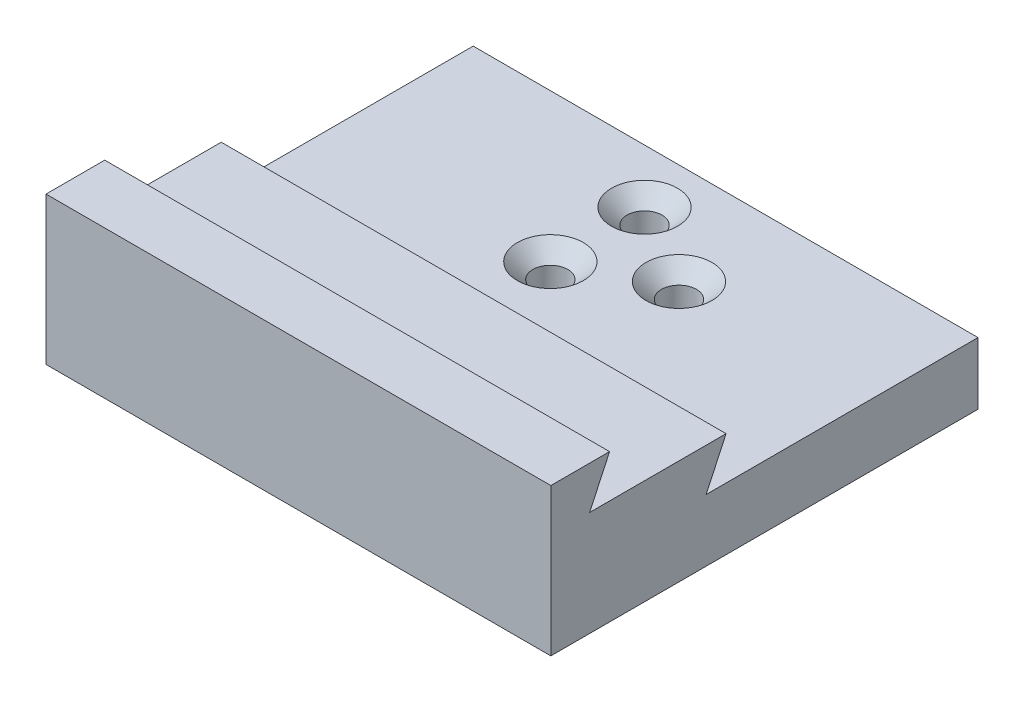
ISO-10303-21;
HEADER;
FILE_DESCRIPTION(('STEP AP214'),'2;1');
FILE_NAME('part.step','',(''),(''),'','','');
FILE_SCHEMA(('AUTOMOTIVE_DESIGN { 1 0 10303 214 1 1 1 1 }'));
ENDSEC;
DATA;
#1=APPLICATION_CONTEXT('core data for automotive mechanical design processes');
#2=APPLICATION_PROTOCOL_DEFINITION('international standard','automotive_design',2000,#1);
#3=PRODUCT_CONTEXT('',#1,'mechanical');
#4=PRODUCT('Part','Part','',(#3));
#5=PRODUCT_RELATED_PRODUCT_CATEGORY('part','',(#4));
#6=PRODUCT_DEFINITION_FORMATION('','',#4);
#7=PRODUCT_DEFINITION_CONTEXT('part definition',#1,'design');
#8=PRODUCT_DEFINITION('design','',#6,#7);
#9=PRODUCT_DEFINITION_SHAPE('','',#8);
#10=(LENGTH_UNIT() NAMED_UNIT(*) SI_UNIT(.MILLI.,.METRE.));
#11=(NAMED_UNIT(*) PLANE_ANGLE_UNIT() SI_UNIT($,.RADIAN.));
#12=(NAMED_UNIT(*) SI_UNIT($,.STERADIAN.) SOLID_ANGLE_UNIT());
#13=UNCERTAINTY_MEASURE_WITH_UNIT(LENGTH_MEASURE(1.E-05),#10,'distance_accuracy_value','');
#14=(GEOMETRIC_REPRESENTATION_CONTEXT(3) GLOBAL_UNCERTAINTY_ASSIGNED_CONTEXT((#13)) GLOBAL_UNIT_ASSIGNED_CONTEXT((#10,
#11,#12)) REPRESENTATION_CONTEXT('',''));
#15=CARTESIAN_POINT('',(0.,0.,0.));
#16=DIRECTION('',(0.,0.,1.));
#17=DIRECTION('',(1.,0.,0.));
#18=AXIS2_PLACEMENT_3D('',#15,#16,#17);
#19=CARTESIAN_POINT('',(65.,0.,-55.));
#20=DIRECTION('',(0.,1.,0.));
#21=DIRECTION('',(0.,0.,1.));
#22=AXIS2_PLACEMENT_3D('',#19,#20,#21);
#23=PLANE('',#22);
#24=CARTESIAN_POINT('',(39.5,0.,-42.));
#25=DIRECTION('',(0.,1.,0.));
#26=DIRECTION('',(0.,0.,1.));
#27=AXIS2_PLACEMENT_3D('',#24,#25,#26);
#28=CIRCLE('',#27,2.25);
#29=CARTESIAN_POINT('',(39.5,0.,-39.75));
#30=VERTEX_POINT('',#29);
#31=EDGE_CURVE('E267',#30,#30,#28,.F.);
#32=ORIENTED_EDGE('',*,*,#31,.F.);
#33=EDGE_LOOP('',(#32));
#34=FACE_BOUND('',#33,.T.);
#35=CARTESIAN_POINT('',(29.,0.,-35.9378221735089));
#36=DIRECTION('',(0.,1.,0.));
#37=DIRECTION('',(0.,0.,1.));
#38=AXIS2_PLACEMENT_3D('',#35,#36,#37);
#39=CIRCLE('',#38,2.25000000000001);
#40=CARTESIAN_POINT('',(29.,0.,-33.6878221735089));
#41=VERTEX_POINT('',#40);
#42=EDGE_CURVE('E269',#41,#41,#39,.F.);
#43=ORIENTED_EDGE('',*,*,#42,.F.);
#44=EDGE_LOOP('',(#43));
#45=FACE_BOUND('',#44,.T.);
#46=CARTESIAN_POINT('',(29.0000000000001,0.,-48.0621778264911));
#47=DIRECTION('',(0.,1.,0.));
#48=DIRECTION('',(0.,0.,1.));
#49=AXIS2_PLACEMENT_3D('',#46,#47,#48);
#50=CIRCLE('',#49,2.25);
#51=CARTESIAN_POINT('',(29.0000000000001,0.,-45.8121778264911));
#52=VERTEX_POINT('',#51);
#53=EDGE_CURVE('E275',#52,#52,#50,.F.);
#54=ORIENTED_EDGE('',*,*,#53,.F.);
#55=EDGE_LOOP('',(#54));
#56=FACE_BOUND('',#55,.T.);
#57=DIRECTION('',(0.,0.,-1.));
#58=VECTOR('',#57,1.);
#59=CARTESIAN_POINT('',(0.,0.,-55.));
#60=LINE('',#59,#58);
#61=CARTESIAN_POINT('',(0.,0.,0.));
#62=VERTEX_POINT('',#61);
#63=CARTESIAN_POINT('',(0.,0.,-55.));
#64=VERTEX_POINT('',#63);
#65=EDGE_CURVE('E133',#62,#64,#60,.T.);
#66=ORIENTED_EDGE('',*,*,#65,.T.);
#67=DIRECTION('',(-1.,0.,0.));
#68=VECTOR('',#67,1.);
#69=CARTESIAN_POINT('',(65.,0.,-55.));
#70=LINE('',#69,#68);
#71=CARTESIAN_POINT('',(65.,0.,-55.));
#72=VERTEX_POINT('',#71);
#73=EDGE_CURVE('E161',#72,#64,#70,.T.);
#74=ORIENTED_EDGE('',*,*,#73,.F.);
#75=DIRECTION('',(0.,0.,-1.));
#76=VECTOR('',#75,1.);
#77=CARTESIAN_POINT('',(65.,0.,-55.));
#78=LINE('',#77,#76);
#79=CARTESIAN_POINT('',(65.,0.,0.));
#80=VERTEX_POINT('',#79);
#81=EDGE_CURVE('E148',#80,#72,#78,.T.);
#82=ORIENTED_EDGE('',*,*,#81,.F.);
#83=DIRECTION('',(-1.,0.,0.));
#84=VECTOR('',#83,1.);
#85=CARTESIAN_POINT('',(65.,0.,0.));
#86=LINE('',#85,#84);
#87=EDGE_CURVE('E129',#80,#62,#86,.T.);
#88=ORIENTED_EDGE('',*,*,#87,.T.);
#89=EDGE_LOOP('',(#66,#74,#82,#88));
#90=FACE_BOUND('',#89,.T.);
#91=ADVANCED_FACE('F34',(#34,#45,#56,#90),#23,.F.);
#92=CARTESIAN_POINT('',(65.,8.00000000000001,-55.));
#93=DIRECTION('',(0.,0.,1.));
#94=DIRECTION('',(1.,0.,0.));
#95=AXIS2_PLACEMENT_3D('',#92,#93,#94);
#96=PLANE('',#95);
#97=CARTESIAN_POINT('',(12.5,4.50000000000001,-55.));
#98=DIRECTION('',(0.,0.,-1.));
#99=DIRECTION('',(-1.,0.,0.));
#100=AXIS2_PLACEMENT_3D('',#97,#98,#99);
#101=CIRCLE('',#100,2.);
#102=CARTESIAN_POINT('',(10.5,4.50000000000001,-55.));
#103=VERTEX_POINT('',#102);
#104=EDGE_CURVE('E282',#103,#103,#101,.T.);
#105=ORIENTED_EDGE('',*,*,#104,.F.);
#106=EDGE_LOOP('',(#105));
#107=FACE_BOUND('',#106,.T.);
#108=CARTESIAN_POINT('',(52.5,4.50000000000001,-55.));
#109=DIRECTION('',(0.,0.,-1.));
#110=DIRECTION('',(1.,0.,0.));
#111=AXIS2_PLACEMENT_3D('',#108,#109,#110);
#112=CIRCLE('',#111,2.);
#113=CARTESIAN_POINT('',(54.5,4.50000000000001,-55.));
#114=VERTEX_POINT('',#113);
#115=EDGE_CURVE('E268',#114,#114,#112,.T.);
#116=ORIENTED_EDGE('',*,*,#115,.F.);
#117=EDGE_LOOP('',(#116));
#118=FACE_BOUND('',#117,.T.);
#119=DIRECTION('',(0.,1.,0.));
#120=VECTOR('',#119,1.);
#121=CARTESIAN_POINT('',(0.,8.00000000000001,-55.));
#122=LINE('',#121,#120);
#123=CARTESIAN_POINT('',(0.,8.00000000000001,-55.));
#124=VERTEX_POINT('',#123);
#125=EDGE_CURVE('E136',#64,#124,#122,.T.);
#126=ORIENTED_EDGE('',*,*,#125,.T.);
#127=DIRECTION('',(-1.,0.,0.));
#128=VECTOR('',#127,1.);
#129=CARTESIAN_POINT('',(65.,8.00000000000001,-55.));
#130=LINE('',#129,#128);
#131=CARTESIAN_POINT('',(65.,8.00000000000001,-55.));
#132=VERTEX_POINT('',#131);
#133=EDGE_CURVE('E158',#132,#124,#130,.T.);
#134=ORIENTED_EDGE('',*,*,#133,.F.);
#135=DIRECTION('',(0.,1.,0.));
#136=VECTOR('',#135,1.);
#137=CARTESIAN_POINT('',(65.,8.00000000000001,-55.));
#138=LINE('',#137,#136);
#139=EDGE_CURVE('E96',#72,#132,#138,.T.);
#140=ORIENTED_EDGE('',*,*,#139,.F.);
#141=ORIENTED_EDGE('',*,*,#73,.T.);
#142=EDGE_LOOP('',(#126,#134,#140,#141));
#143=FACE_BOUND('',#142,.T.);
#144=ADVANCED_FACE('F195',(#107,#118,#143),#96,.F.);
#145=CARTESIAN_POINT('',(65.,8.00000000000001,-20.));
#146=DIRECTION('',(0.,-1.,0.));
#147=DIRECTION('',(0.,0.,-1.));
#148=AXIS2_PLACEMENT_3D('',#145,#146,#147);
#149=PLANE('',#148);
#150=CARTESIAN_POINT('',(29.,8.00000000000001,-35.9378221735089));
#151=DIRECTION('',(0.,-1.,0.));
#152=DIRECTION('',(0.,0.,-1.));
#153=AXIS2_PLACEMENT_3D('',#150,#151,#152);
#154=CIRCLE('',#153,4.25000000000002);
#155=CARTESIAN_POINT('',(29.,8.00000000000001,-40.187822173509));
#156=VERTEX_POINT('',#155);
#157=EDGE_CURVE('E172',#156,#156,#154,.T.);
#158=ORIENTED_EDGE('',*,*,#157,.T.);
#159=EDGE_LOOP('',(#158));
#160=FACE_BOUND('',#159,.T.);
#161=CARTESIAN_POINT('',(29.0000000000001,8.00000000000001,-48.0621778264911));
#162=DIRECTION('',(0.,-1.,0.));
#163=DIRECTION('',(0.,0.,-1.));
#164=AXIS2_PLACEMENT_3D('',#161,#162,#163);
#165=CIRCLE('',#164,4.25000000000001);
#166=CARTESIAN_POINT('',(29.0000000000001,8.00000000000001,-52.3121778264911));
#167=VERTEX_POINT('',#166);
#168=EDGE_CURVE('E169',#167,#167,#165,.T.);
#169=ORIENTED_EDGE('',*,*,#168,.T.);
#170=EDGE_LOOP('',(#169));
#171=FACE_BOUND('',#170,.T.);
#172=CARTESIAN_POINT('',(39.5,8.00000000000001,-42.));
#173=DIRECTION('',(0.,-1.,0.));
#174=DIRECTION('',(0.,0.,-1.));
#175=AXIS2_PLACEMENT_3D('',#172,#173,#174);
#176=CIRCLE('',#175,4.25000000000002);
#177=CARTESIAN_POINT('',(39.5,8.00000000000001,-46.25));
#178=VERTEX_POINT('',#177);
#179=EDGE_CURVE('E166',#178,#178,#176,.T.);
#180=ORIENTED_EDGE('',*,*,#179,.T.);
#181=EDGE_LOOP('',(#180));
#182=FACE_BOUND('',#181,.T.);
#183=DIRECTION('',(0.,0.,1.));
#184=VECTOR('',#183,1.);
#185=CARTESIAN_POINT('',(0.,8.00000000000001,-20.));
#186=LINE('',#185,#184);
#187=CARTESIAN_POINT('',(0.,8.00000000000001,-20.));
#188=VERTEX_POINT('',#187);
#189=EDGE_CURVE('E139',#124,#188,#186,.T.);
#190=ORIENTED_EDGE('',*,*,#189,.T.);
#191=DIRECTION('',(-1.,0.,0.));
#192=VECTOR('',#191,1.);
#193=CARTESIAN_POINT('',(65.,8.00000000000001,-20.));
#194=LINE('',#193,#192);
#195=CARTESIAN_POINT('',(65.,8.00000000000001,-20.));
#196=VERTEX_POINT('',#195);
#197=EDGE_CURVE('E155',#196,#188,#194,.T.);
#198=ORIENTED_EDGE('',*,*,#197,.F.);
#199=DIRECTION('',(0.,0.,1.));
#200=VECTOR('',#199,1.);
#201=CARTESIAN_POINT('',(65.,8.00000000000001,-20.));
#202=LINE('',#201,#200);
#203=EDGE_CURVE('E289',#132,#196,#202,.T.);
#204=ORIENTED_EDGE('',*,*,#203,.F.);
#205=ORIENTED_EDGE('',*,*,#133,.T.);
#206=EDGE_LOOP('',(#190,#198,#204,#205));
#207=FACE_BOUND('',#206,.T.);
#208=ADVANCED_FACE('F201',(#160,#171,#182,#207),#149,.F.);
#209=CARTESIAN_POINT('',(65.,13.5,-22.5646921198525));
#210=DIRECTION('',(0.,0.422618261740704,0.906307787036648));
#211=DIRECTION('',(0.,-0.906307787036648,0.422618261740704));
#212=AXIS2_PLACEMENT_3D('',#209,#210,#211);
#213=PLANE('',#212);
#214=DIRECTION('',(0.,0.906307787036648,-0.422618261740704));
#215=VECTOR('',#214,1.);
#216=CARTESIAN_POINT('',(0.,13.5,-22.5646921198525));
#217=LINE('',#216,#215);
#218=CARTESIAN_POINT('',(0.,13.5,-22.5646921198525));
#219=VERTEX_POINT('',#218);
#220=EDGE_CURVE('E141',#188,#219,#217,.T.);
#221=ORIENTED_EDGE('',*,*,#220,.T.);
#222=DIRECTION('',(-1.,0.,0.));
#223=VECTOR('',#222,1.);
#224=CARTESIAN_POINT('',(65.,13.5,-22.5646921198525));
#225=LINE('',#224,#223);
#226=CARTESIAN_POINT('',(65.,13.5,-22.5646921198525));
#227=VERTEX_POINT('',#226);
#228=EDGE_CURVE('E152',#227,#219,#225,.T.);
#229=ORIENTED_EDGE('',*,*,#228,.F.);
#230=DIRECTION('',(0.,0.906307787036648,-0.422618261740704));
#231=VECTOR('',#230,1.);
#232=CARTESIAN_POINT('',(65.,13.5,-22.5646921198525));
#233=LINE('',#232,#231);
#234=EDGE_CURVE('E291',#196,#227,#233,.T.);
#235=ORIENTED_EDGE('',*,*,#234,.F.);
#236=ORIENTED_EDGE('',*,*,#197,.T.);
#237=EDGE_LOOP('',(#221,#229,#235,#236));
#238=FACE_BOUND('',#237,.T.);
#239=ADVANCED_FACE('F216',(#238),#213,.F.);
#240=CARTESIAN_POINT('',(65.,13.5,-5.));
#241=DIRECTION('',(0.,-1.,0.));
#242=DIRECTION('',(0.,0.,-1.));
#243=AXIS2_PLACEMENT_3D('',#240,#241,#242);
#244=PLANE('',#243);
#245=DIRECTION('',(0.,0.,1.));
#246=VECTOR('',#245,1.);
#247=CARTESIAN_POINT('',(0.,13.5,-5.));
#248=LINE('',#247,#246);
#249=CARTESIAN_POINT('',(0.,13.5,-5.));
#250=VERTEX_POINT('',#249);
#251=EDGE_CURVE('E143',#219,#250,#248,.T.);
#252=ORIENTED_EDGE('',*,*,#251,.T.);
#253=DIRECTION('',(-1.,0.,0.));
#254=VECTOR('',#253,1.);
#255=CARTESIAN_POINT('',(65.,13.5,-5.));
#256=LINE('',#255,#254);
#257=CARTESIAN_POINT('',(65.,13.5,-5.));
#258=VERTEX_POINT('',#257);
#259=EDGE_CURVE('E124',#258,#250,#256,.T.);
#260=ORIENTED_EDGE('',*,*,#259,.F.);
#261=DIRECTION('',(0.,0.,1.));
#262=VECTOR('',#261,1.);
#263=CARTESIAN_POINT('',(65.,13.5,-5.));
#264=LINE('',#263,#262);
#265=EDGE_CURVE('E115',#227,#258,#264,.T.);
#266=ORIENTED_EDGE('',*,*,#265,.F.);
#267=ORIENTED_EDGE('',*,*,#228,.T.);
#268=EDGE_LOOP('',(#252,#260,#266,#267));
#269=FACE_BOUND('',#268,.T.);
#270=ADVANCED_FACE('F220',(#269),#244,.F.);
#271=CARTESIAN_POINT('',(65.,19.,-7.56469211985252));
#272=DIRECTION('',(0.,0.422618261740704,0.906307787036648));
#273=DIRECTION('',(0.,-0.906307787036648,0.422618261740704));
#274=AXIS2_PLACEMENT_3D('',#271,#272,#273);
#275=PLANE('',#274);
#276=DIRECTION('',(0.,0.906307787036648,-0.422618261740704));
#277=VECTOR('',#276,1.);
#278=CARTESIAN_POINT('',(0.,19.,-7.56469211985252));
#279=LINE('',#278,#277);
#280=CARTESIAN_POINT('',(0.,19.,-7.56469211985252));
#281=VERTEX_POINT('',#280);
#282=EDGE_CURVE('E123',#250,#281,#279,.T.);
#283=ORIENTED_EDGE('',*,*,#282,.T.);
#284=DIRECTION('',(-1.,0.,0.));
#285=VECTOR('',#284,1.);
#286=CARTESIAN_POINT('',(65.,19.,-7.56469211985252));
#287=LINE('',#286,#285);
#288=CARTESIAN_POINT('',(65.,19.,-7.56469211985252));
#289=VERTEX_POINT('',#288);
#290=EDGE_CURVE('E120',#289,#281,#287,.T.);
#291=ORIENTED_EDGE('',*,*,#290,.F.);
#292=DIRECTION('',(0.,0.906307787036648,-0.422618261740704));
#293=VECTOR('',#292,1.);
#294=CARTESIAN_POINT('',(65.,19.,-7.56469211985252));
#295=LINE('',#294,#293);
#296=EDGE_CURVE('E109',#258,#289,#295,.T.);
#297=ORIENTED_EDGE('',*,*,#296,.F.);
#298=ORIENTED_EDGE('',*,*,#259,.T.);
#299=EDGE_LOOP('',(#283,#291,#297,#298));
#300=FACE_BOUND('',#299,.T.);
#301=ADVANCED_FACE('F121',(#300),#275,.F.);
#302=CARTESIAN_POINT('',(65.,19.,0.));
#303=DIRECTION('',(0.,-1.,0.));
#304=DIRECTION('',(0.,0.,-1.));
#305=AXIS2_PLACEMENT_3D('',#302,#303,#304);
#306=PLANE('',#305);
#307=DIRECTION('',(0.,0.,1.));
#308=VECTOR('',#307,1.);
#309=CARTESIAN_POINT('',(0.,19.,0.));
#310=LINE('',#309,#308);
#311=CARTESIAN_POINT('',(0.,19.,0.));
#312=VERTEX_POINT('',#311);
#313=EDGE_CURVE('E81',#281,#312,#310,.T.);
#314=ORIENTED_EDGE('',*,*,#313,.T.);
#315=DIRECTION('',(-1.,0.,0.));
#316=VECTOR('',#315,1.);
#317=CARTESIAN_POINT('',(65.,19.,0.));
#318=LINE('',#317,#316);
#319=CARTESIAN_POINT('',(65.,19.,0.));
#320=VERTEX_POINT('',#319);
#321=EDGE_CURVE('E125',#320,#312,#318,.T.);
#322=ORIENTED_EDGE('',*,*,#321,.F.);
#323=DIRECTION('',(0.,0.,1.));
#324=VECTOR('',#323,1.);
#325=CARTESIAN_POINT('',(65.,19.,0.));
#326=LINE('',#325,#324);
#327=EDGE_CURVE('E113',#289,#320,#326,.T.);
#328=ORIENTED_EDGE('',*,*,#327,.F.);
#329=ORIENTED_EDGE('',*,*,#290,.T.);
#330=EDGE_LOOP('',(#314,#322,#328,#329));
#331=FACE_BOUND('',#330,.T.);
#332=ADVANCED_FACE('F127',(#331),#306,.F.);
#333=CARTESIAN_POINT('',(65.,0.,0.));
#334=DIRECTION('',(0.,0.,-1.));
#335=DIRECTION('',(-1.,0.,0.));
#336=AXIS2_PLACEMENT_3D('',#333,#334,#335);
#337=PLANE('',#336);
#338=DIRECTION('',(0.,-1.,0.));
#339=VECTOR('',#338,1.);
#340=CARTESIAN_POINT('',(0.,0.,0.));
#341=LINE('',#340,#339);
#342=EDGE_CURVE('E87',#312,#62,#341,.T.);
#343=ORIENTED_EDGE('',*,*,#342,.T.);
#344=ORIENTED_EDGE('',*,*,#87,.F.);
#345=DIRECTION('',(0.,-1.,0.));
#346=VECTOR('',#345,1.);
#347=CARTESIAN_POINT('',(65.,0.,0.));
#348=LINE('',#347,#346);
#349=EDGE_CURVE('E52',#320,#80,#348,.T.);
#350=ORIENTED_EDGE('',*,*,#349,.F.);
#351=ORIENTED_EDGE('',*,*,#321,.T.);
#352=EDGE_LOOP('',(#343,#344,#350,#351));
#353=FACE_BOUND('',#352,.T.);
#354=ADVANCED_FACE('F229',(#353),#337,.F.);
#355=CARTESIAN_POINT('',(65.,0.,0.));
#356=DIRECTION('',(-1.,0.,0.));
#357=DIRECTION('',(0.,0.,1.));
#358=AXIS2_PLACEMENT_3D('',#355,#356,#357);
#359=PLANE('',#358);
#360=ORIENTED_EDGE('',*,*,#81,.T.);
#361=ORIENTED_EDGE('',*,*,#139,.T.);
#362=ORIENTED_EDGE('',*,*,#203,.T.);
#363=ORIENTED_EDGE('',*,*,#234,.T.);
#364=ORIENTED_EDGE('',*,*,#265,.T.);
#365=ORIENTED_EDGE('',*,*,#296,.T.);
#366=ORIENTED_EDGE('',*,*,#327,.T.);
#367=ORIENTED_EDGE('',*,*,#349,.T.);
#368=EDGE_LOOP('',(#360,#361,#362,#363,#364,#365,#366,#367));
#369=FACE_BOUND('',#368,.T.);
#370=ADVANCED_FACE('F111',(#369),#359,.F.);
#371=CARTESIAN_POINT('',(0.,0.,0.));
#372=DIRECTION('',(-1.,0.,0.));
#373=DIRECTION('',(0.,0.,1.));
#374=AXIS2_PLACEMENT_3D('',#371,#372,#373);
#375=PLANE('',#374);
#376=ORIENTED_EDGE('',*,*,#65,.F.);
#377=ORIENTED_EDGE('',*,*,#342,.F.);
#378=ORIENTED_EDGE('',*,*,#313,.F.);
#379=ORIENTED_EDGE('',*,*,#282,.F.);
#380=ORIENTED_EDGE('',*,*,#251,.F.);
#381=ORIENTED_EDGE('',*,*,#220,.F.);
#382=ORIENTED_EDGE('',*,*,#189,.F.);
#383=ORIENTED_EDGE('',*,*,#125,.F.);
#384=EDGE_LOOP('',(#376,#377,#378,#379,#380,#381,#382,#383));
#385=FACE_BOUND('',#384,.T.);
#386=ADVANCED_FACE('F232',(#385),#375,.T.);
#387=CARTESIAN_POINT('',(52.5,4.50000000000001,-35.));
#388=DIRECTION('',(0.,0.,-1.));
#389=DIRECTION('',(-1.,0.,0.));
#390=AXIS2_PLACEMENT_3D('',#387,#388,#389);
#391=CYLINDRICAL_SURFACE('',#390,2.);
#392=CARTESIAN_POINT('',(52.5,4.50000000000001,-35.));
#393=DIRECTION('',(0.,0.,-1.));
#394=DIRECTION('',(1.,0.,0.));
#395=AXIS2_PLACEMENT_3D('',#392,#393,#394);
#396=CIRCLE('',#395,2.);
#397=CARTESIAN_POINT('',(54.5,4.50000000000001,-35.));
#398=VERTEX_POINT('',#397);
#399=EDGE_CURVE('E272',#398,#398,#396,.T.);
#400=ORIENTED_EDGE('',*,*,#399,.F.);
#401=EDGE_LOOP('',(#400));
#402=FACE_BOUND('',#401,.T.);
#403=ORIENTED_EDGE('',*,*,#115,.T.);
#404=EDGE_LOOP('',(#403));
#405=FACE_BOUND('',#404,.T.);
#406=ADVANCED_FACE('F235',(#402,#405),#391,.F.);
#407=CARTESIAN_POINT('',(52.5,4.50000000000001,-35.));
#408=DIRECTION('',(0.,0.,1.));
#409=DIRECTION('',(1.,0.,0.));
#410=AXIS2_PLACEMENT_3D('',#407,#408,#409);
#411=PLANE('',#410);
#412=ORIENTED_EDGE('',*,*,#399,.T.);
#413=EDGE_LOOP('',(#412));
#414=FACE_BOUND('',#413,.T.);
#415=ADVANCED_FACE('F241',(#414),#411,.F.);
#416=CARTESIAN_POINT('',(12.5,4.50000000000001,-35.));
#417=DIRECTION('',(0.,0.,-1.));
#418=DIRECTION('',(-1.,0.,0.));
#419=AXIS2_PLACEMENT_3D('',#416,#417,#418);
#420=CYLINDRICAL_SURFACE('',#419,2.);
#421=CARTESIAN_POINT('',(12.5,4.50000000000001,-35.));
#422=DIRECTION('',(0.,0.,-1.));
#423=DIRECTION('',(-1.,0.,0.));
#424=AXIS2_PLACEMENT_3D('',#421,#422,#423);
#425=CIRCLE('',#424,2.);
#426=CARTESIAN_POINT('',(10.5,4.50000000000001,-35.));
#427=VERTEX_POINT('',#426);
#428=EDGE_CURVE('E137',#427,#427,#425,.T.);
#429=ORIENTED_EDGE('',*,*,#428,.F.);
#430=EDGE_LOOP('',(#429));
#431=FACE_BOUND('',#430,.T.);
#432=ORIENTED_EDGE('',*,*,#104,.T.);
#433=EDGE_LOOP('',(#432));
#434=FACE_BOUND('',#433,.T.);
#435=ADVANCED_FACE('F245',(#431,#434),#420,.F.);
#436=CARTESIAN_POINT('',(12.5,4.50000000000001,-35.));
#437=DIRECTION('',(0.,0.,-1.));
#438=DIRECTION('',(-1.,0.,0.));
#439=AXIS2_PLACEMENT_3D('',#436,#437,#438);
#440=PLANE('',#439);
#441=ORIENTED_EDGE('',*,*,#428,.T.);
#442=EDGE_LOOP('',(#441));
#443=FACE_BOUND('',#442,.T.);
#444=ADVANCED_FACE('F249',(#443),#440,.T.);
#445=CARTESIAN_POINT('',(29.0000000000001,-6.36396103067895,-48.0621778264911));
#446=DIRECTION('',(0.,1.,0.));
#447=DIRECTION('',(0.,0.,1.));
#448=AXIS2_PLACEMENT_3D('',#445,#446,#447);
#449=CYLINDRICAL_SURFACE('',#448,2.25);
#450=CARTESIAN_POINT('',(29.0000000000001,6.00000000000001,-48.0621778264911));
#451=DIRECTION('',(0.,-1.,0.));
#452=DIRECTION('',(0.,0.,-1.));
#453=AXIS2_PLACEMENT_3D('',#450,#451,#452);
#454=CIRCLE('',#453,2.25);
#455=CARTESIAN_POINT('',(29.0000000000001,6.00000000000001,-50.3121778264911));
#456=VERTEX_POINT('',#455);
#457=EDGE_CURVE('E44',#456,#456,#454,.F.);
#458=ORIENTED_EDGE('',*,*,#457,.T.);
#459=EDGE_LOOP('',(#458));
#460=FACE_BOUND('',#459,.T.);
#461=ORIENTED_EDGE('',*,*,#53,.T.);
#462=EDGE_LOOP('',(#461));
#463=FACE_BOUND('',#462,.T.);
#464=ADVANCED_FACE('F177',(#460,#463),#449,.F.);
#465=CARTESIAN_POINT('',(29.,-6.36396103067895,-35.9378221735089));
#466=DIRECTION('',(0.,1.,0.));
#467=DIRECTION('',(0.,0.,1.));
#468=AXIS2_PLACEMENT_3D('',#465,#466,#467);
#469=CYLINDRICAL_SURFACE('',#468,2.25000000000001);
#470=CARTESIAN_POINT('',(29.,6.,-35.9378221735089));
#471=DIRECTION('',(0.,-1.,0.));
#472=DIRECTION('',(0.,0.,-1.));
#473=AXIS2_PLACEMENT_3D('',#470,#471,#472);
#474=CIRCLE('',#473,2.25000000000001);
#475=CARTESIAN_POINT('',(29.,6.,-38.187822173509));
#476=VERTEX_POINT('',#475);
#477=EDGE_CURVE('E163',#476,#476,#474,.F.);
#478=ORIENTED_EDGE('',*,*,#477,.T.);
#479=EDGE_LOOP('',(#478));
#480=FACE_BOUND('',#479,.T.);
#481=ORIENTED_EDGE('',*,*,#42,.T.);
#482=EDGE_LOOP('',(#481));
#483=FACE_BOUND('',#482,.T.);
#484=ADVANCED_FACE('F256',(#480,#483),#469,.F.);
#485=CARTESIAN_POINT('',(39.5,-6.36396103067895,-42.));
#486=DIRECTION('',(0.,1.,0.));
#487=DIRECTION('',(0.,0.,1.));
#488=AXIS2_PLACEMENT_3D('',#485,#486,#487);
#489=CYLINDRICAL_SURFACE('',#488,2.25);
#490=CARTESIAN_POINT('',(39.5,6.00000000000001,-42.));
#491=DIRECTION('',(0.,-1.,0.));
#492=DIRECTION('',(0.,0.,-1.));
#493=AXIS2_PLACEMENT_3D('',#490,#491,#492);
#494=CIRCLE('',#493,2.25);
#495=CARTESIAN_POINT('',(39.5,6.00000000000001,-44.25));
#496=VERTEX_POINT('',#495);
#497=EDGE_CURVE('E11',#496,#496,#494,.F.);
#498=ORIENTED_EDGE('',*,*,#497,.T.);
#499=EDGE_LOOP('',(#498));
#500=FACE_BOUND('',#499,.T.);
#501=ORIENTED_EDGE('',*,*,#31,.T.);
#502=EDGE_LOOP('',(#501));
#503=FACE_BOUND('',#502,.T.);
#504=ADVANCED_FACE('F189',(#500,#503),#489,.F.);
#505=CARTESIAN_POINT('',(29.,6.,-35.9378221735089));
#506=DIRECTION('',(0.,1.,0.));
#507=DIRECTION('',(0.,0.,1.));
#508=AXIS2_PLACEMENT_3D('',#505,#506,#507);
#509=CONICAL_SURFACE('',#508,2.25000000000001,0.785398163397449);
#510=ORIENTED_EDGE('',*,*,#157,.F.);
#511=EDGE_LOOP('',(#510));
#512=FACE_BOUND('',#511,.T.);
#513=ORIENTED_EDGE('',*,*,#477,.F.);
#514=EDGE_LOOP('',(#513));
#515=FACE_BOUND('',#514,.T.);
#516=ADVANCED_FACE('F182',(#512,#515),#509,.F.);
#517=CARTESIAN_POINT('',(29.0000000000001,6.00000000000001,-48.0621778264911));
#518=DIRECTION('',(0.,1.,0.));
#519=DIRECTION('',(0.,0.,1.));
#520=AXIS2_PLACEMENT_3D('',#517,#518,#519);
#521=CONICAL_SURFACE('',#520,2.25,0.785398163397451);
#522=ORIENTED_EDGE('',*,*,#168,.F.);
#523=EDGE_LOOP('',(#522));
#524=FACE_BOUND('',#523,.T.);
#525=ORIENTED_EDGE('',*,*,#457,.F.);
#526=EDGE_LOOP('',(#525));
#527=FACE_BOUND('',#526,.T.);
#528=ADVANCED_FACE('F180',(#524,#527),#521,.F.);
#529=CARTESIAN_POINT('',(39.5,6.00000000000001,-42.));
#530=DIRECTION('',(0.,1.,0.));
#531=DIRECTION('',(0.,0.,1.));
#532=AXIS2_PLACEMENT_3D('',#529,#530,#531);
#533=CONICAL_SURFACE('',#532,2.25,0.785398163397452);
#534=ORIENTED_EDGE('',*,*,#179,.F.);
#535=EDGE_LOOP('',(#534));
#536=FACE_BOUND('',#535,.T.);
#537=ORIENTED_EDGE('',*,*,#497,.F.);
#538=EDGE_LOOP('',(#537));
#539=FACE_BOUND('',#538,.T.);
#540=ADVANCED_FACE('F37',(#536,#539),#533,.F.);
#541=CLOSED_SHELL('',(#91,#144,#208,#239,#270,#301,#332,#354,#370,#386,#406,#415,#435,#444,#464,
#484,#504,#516,#528,#540));
#542=MANIFOLD_SOLID_BREP('B2',#541);
#543=ADVANCED_BREP_SHAPE_REPRESENTATION('',(#18,#542),#14);
#544=SHAPE_DEFINITION_REPRESENTATION(#9,#543);
ENDSEC;
END-ISO-10303-21;
